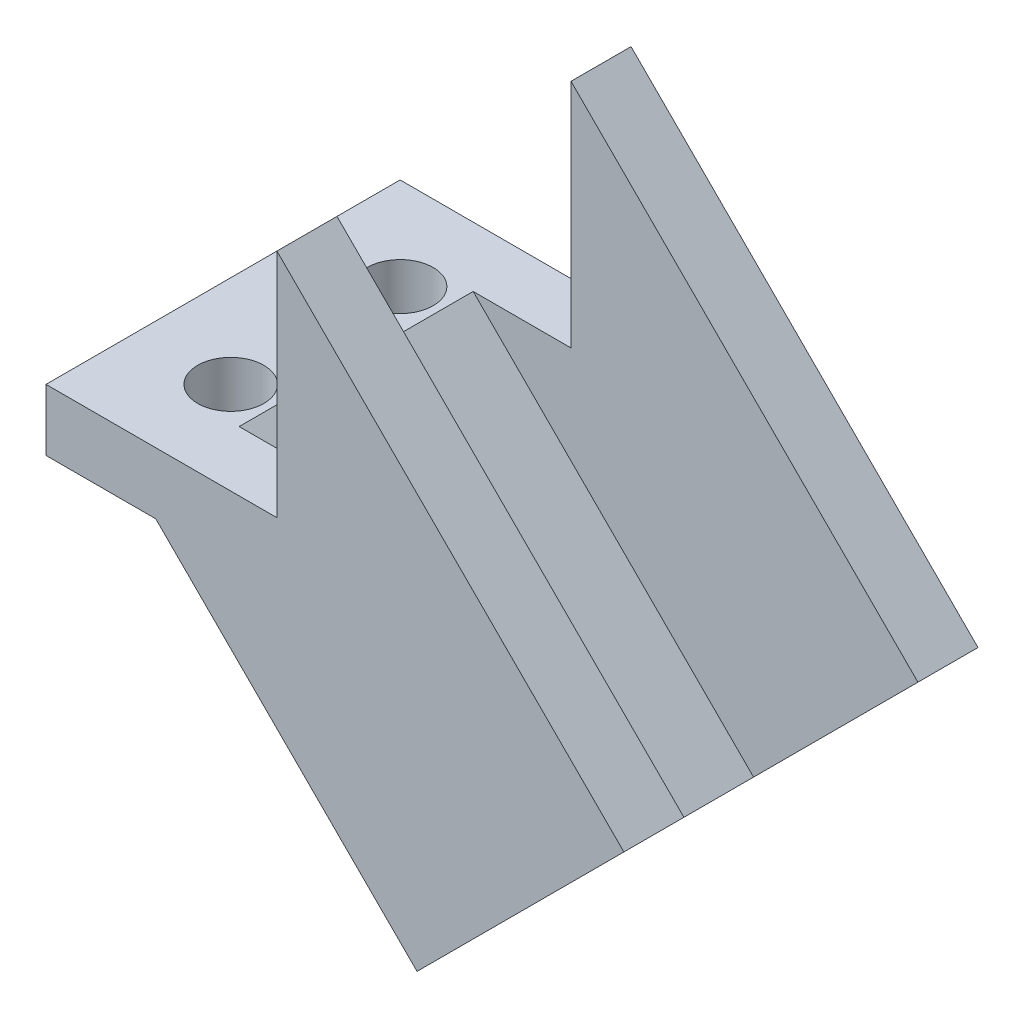
ISO-10303-21;
HEADER;
FILE_DESCRIPTION(('STEP AP214'),'2;1');
FILE_NAME('part.step','',(''),(''),'','','');
FILE_SCHEMA(('AUTOMOTIVE_DESIGN { 1 0 10303 214 1 1 1 1 }'));
ENDSEC;
DATA;
#1=APPLICATION_CONTEXT('core data for automotive mechanical design processes');
#2=APPLICATION_PROTOCOL_DEFINITION('international standard','automotive_design',2000,#1);
#3=PRODUCT_CONTEXT('',#1,'mechanical');
#4=PRODUCT('Part','Part','',(#3));
#5=PRODUCT_RELATED_PRODUCT_CATEGORY('part','',(#4));
#6=PRODUCT_DEFINITION_FORMATION('','',#4);
#7=PRODUCT_DEFINITION_CONTEXT('part definition',#1,'design');
#8=PRODUCT_DEFINITION('design','',#6,#7);
#9=PRODUCT_DEFINITION_SHAPE('','',#8);
#10=(LENGTH_UNIT() NAMED_UNIT(*) SI_UNIT(.MILLI.,.METRE.));
#11=(NAMED_UNIT(*) PLANE_ANGLE_UNIT() SI_UNIT($,.RADIAN.));
#12=(NAMED_UNIT(*) SI_UNIT($,.STERADIAN.) SOLID_ANGLE_UNIT());
#13=UNCERTAINTY_MEASURE_WITH_UNIT(LENGTH_MEASURE(1.E-05),#10,'distance_accuracy_value','');
#14=(GEOMETRIC_REPRESENTATION_CONTEXT(3) GLOBAL_UNCERTAINTY_ASSIGNED_CONTEXT((#13)) GLOBAL_UNIT_ASSIGNED_CONTEXT((#10,
#11,#12)) REPRESENTATION_CONTEXT('',''));
#15=CARTESIAN_POINT('',(0.,0.,0.));
#16=DIRECTION('',(0.,0.,1.));
#17=DIRECTION('',(1.,0.,0.));
#18=AXIS2_PLACEMENT_3D('',#15,#16,#17);
#19=CARTESIAN_POINT('',(-13.8994949366116,276.857098745259,-19.));
#20=DIRECTION('',(-0.707106781186547,-0.707106781186548,0.));
#21=DIRECTION('',(0.707106781186548,-0.707106781186547,0.));
#22=AXIS2_PLACEMENT_3D('',#19,#20,#21);
#23=PLANE('',#22);
#24=CARTESIAN_POINT('',(-19.5563491861039,282.513952994752,-7.5));
#25=DIRECTION('',(-0.707106781186547,-0.707106781186548,0.));
#26=DIRECTION('',(0.707106781186548,-0.707106781186547,0.));
#27=AXIS2_PLACEMENT_3D('',#24,#25,#26);
#28=CIRCLE('',#27,2.15);
#29=CARTESIAN_POINT('',(-18.0360696065529,280.9936734152,-7.5));
#30=VERTEX_POINT('',#29);
#31=EDGE_CURVE('E360',#30,#30,#28,.T.);
#32=ORIENTED_EDGE('',*,*,#31,.F.);
#33=EDGE_LOOP('',(#32));
#34=FACE_BOUND('',#33,.T.);
#35=DIRECTION('',(0.,0.,1.));
#36=VECTOR('',#35,1.);
#37=CARTESIAN_POINT('',(-30.8700576850887,293.827661493736,-19.));
#38=LINE('',#37,#36);
#39=CARTESIAN_POINT('',(-30.8700576850887,293.827661493736,1.83708618159312));
#40=VERTEX_POINT('',#39);
#41=CARTESIAN_POINT('',(-30.8700576850887,293.827661493736,4.));
#42=VERTEX_POINT('',#41);
#43=EDGE_CURVE('E152',#40,#42,#38,.T.);
#44=ORIENTED_EDGE('',*,*,#43,.F.);
#45=CARTESIAN_POINT('',(-32.,294.957603808648,-2.));
#46=DIRECTION('',(-0.707106781186547,-0.707106781186548,0.));
#47=DIRECTION('',(-0.707106781186548,0.707106781186547,0.));
#48=AXIS2_PLACEMENT_3D('',#45,#46,#47);
#49=ELLIPSE('',#48,5.65685424949238,4.);
#50=CARTESIAN_POINT('',(-30.8700576850887,293.827661493736,-5.83708618159312));
#51=VERTEX_POINT('',#50);
#52=EDGE_CURVE('E140',#40,#51,#49,.F.);
#53=ORIENTED_EDGE('',*,*,#52,.T.);
#54=CARTESIAN_POINT('',(-30.8700576850887,293.827661493736,-9.16291381840688));
#55=VERTEX_POINT('',#54);
#56=EDGE_CURVE('E150',#55,#51,#38,.T.);
#57=ORIENTED_EDGE('',*,*,#56,.F.);
#58=CARTESIAN_POINT('',(-32.,294.957603808648,-13.));
#59=DIRECTION('',(-0.707106781186547,-0.707106781186548,0.));
#60=DIRECTION('',(-0.707106781186548,0.707106781186547,0.));
#61=AXIS2_PLACEMENT_3D('',#58,#59,#60);
#62=ELLIPSE('',#61,5.65685424949238,4.);
#63=CARTESIAN_POINT('',(-30.8700576850887,293.827661493736,-16.8370861815931));
#64=VERTEX_POINT('',#63);
#65=EDGE_CURVE('E144',#55,#64,#62,.F.);
#66=ORIENTED_EDGE('',*,*,#65,.T.);
#67=CARTESIAN_POINT('',(-30.8700576850887,293.827661493736,-19.));
#68=VERTEX_POINT('',#67);
#69=EDGE_CURVE('E158',#68,#64,#38,.T.);
#70=ORIENTED_EDGE('',*,*,#69,.F.);
#71=DIRECTION('',(0.707106781186548,-0.707106781186547,0.));
#72=VECTOR('',#71,1.);
#73=CARTESIAN_POINT('',(-13.8994949366116,276.857098745259,-19.));
#74=LINE('',#73,#72);
#75=CARTESIAN_POINT('',(-13.8994949366116,276.857098745259,-19.));
#76=VERTEX_POINT('',#75);
#77=EDGE_CURVE('E250',#68,#76,#74,.T.);
#78=ORIENTED_EDGE('',*,*,#77,.T.);
#79=DIRECTION('',(0.,0.,1.));
#80=VECTOR('',#79,1.);
#81=CARTESIAN_POINT('',(-13.8994949366116,276.857098745259,-19.));
#82=LINE('',#81,#80);
#83=CARTESIAN_POINT('',(-13.8994949366116,276.857098745259,4.));
#84=VERTEX_POINT('',#83);
#85=EDGE_CURVE('E160',#76,#84,#82,.T.);
#86=ORIENTED_EDGE('',*,*,#85,.T.);
#87=DIRECTION('',(0.707106781186548,-0.707106781186547,0.));
#88=VECTOR('',#87,1.);
#89=CARTESIAN_POINT('',(-13.8994949366116,276.857098745259,4.));
#90=LINE('',#89,#88);
#91=EDGE_CURVE('E229',#42,#84,#90,.T.);
#92=ORIENTED_EDGE('',*,*,#91,.F.);
#93=EDGE_LOOP('',(#44,#53,#57,#66,#70,#78,#86,#92));
#94=FACE_BOUND('',#93,.T.);
#95=ADVANCED_FACE('F35',(#34,#94),#23,.T.);
#96=CARTESIAN_POINT('',(-32.,226.827661493736,-13.));
#97=DIRECTION('',(0.,1.,0.));
#98=DIRECTION('',(0.,0.,1.));
#99=AXIS2_PLACEMENT_3D('',#96,#97,#98);
#100=CYLINDRICAL_SURFACE('',#99,2.15);
#101=CARTESIAN_POINT('',(-32.,297.827661493736,-13.));
#102=DIRECTION('',(0.,1.,0.));
#103=DIRECTION('',(0.,0.,1.));
#104=AXIS2_PLACEMENT_3D('',#101,#102,#103);
#105=CIRCLE('',#104,2.15);
#106=CARTESIAN_POINT('',(-32.,297.827661493736,-10.85));
#107=VERTEX_POINT('',#106);
#108=EDGE_CURVE('E153',#107,#107,#105,.F.);
#109=ORIENTED_EDGE('',*,*,#108,.F.);
#110=EDGE_LOOP('',(#109));
#111=FACE_BOUND('',#110,.T.);
#112=CARTESIAN_POINT('',(-32.,293.827661493736,-13.));
#113=DIRECTION('',(0.,-1.,0.));
#114=DIRECTION('',(0.,0.,-1.));
#115=AXIS2_PLACEMENT_3D('',#112,#113,#114);
#116=CIRCLE('',#115,2.15);
#117=CARTESIAN_POINT('',(-32.,293.827661493736,-15.15));
#118=VERTEX_POINT('',#117);
#119=EDGE_CURVE('E181',#118,#118,#116,.F.);
#120=ORIENTED_EDGE('',*,*,#119,.F.);
#121=EDGE_LOOP('',(#120));
#122=FACE_BOUND('',#121,.T.);
#123=ADVANCED_FACE('F280',(#111,#122),#100,.F.);
#124=CARTESIAN_POINT('',(-32.,226.827661493736,-2.));
#125=DIRECTION('',(0.,1.,0.));
#126=DIRECTION('',(0.,0.,1.));
#127=AXIS2_PLACEMENT_3D('',#124,#125,#126);
#128=CYLINDRICAL_SURFACE('',#127,2.15);
#129=CARTESIAN_POINT('',(-32.,297.827661493736,-2.));
#130=DIRECTION('',(0.,1.,0.));
#131=DIRECTION('',(0.,0.,1.));
#132=AXIS2_PLACEMENT_3D('',#129,#130,#131);
#133=CIRCLE('',#132,2.15);
#134=CARTESIAN_POINT('',(-32.,297.827661493736,0.15));
#135=VERTEX_POINT('',#134);
#136=EDGE_CURVE('E182',#135,#135,#133,.F.);
#137=ORIENTED_EDGE('',*,*,#136,.F.);
#138=EDGE_LOOP('',(#137));
#139=FACE_BOUND('',#138,.T.);
#140=CARTESIAN_POINT('',(-32.,293.827661493736,-2.));
#141=DIRECTION('',(0.,-1.,0.));
#142=DIRECTION('',(0.,0.,-1.));
#143=AXIS2_PLACEMENT_3D('',#140,#141,#142);
#144=CIRCLE('',#143,2.15);
#145=CARTESIAN_POINT('',(-32.,293.827661493736,-4.15));
#146=VERTEX_POINT('',#145);
#147=EDGE_CURVE('E184',#146,#146,#144,.F.);
#148=ORIENTED_EDGE('',*,*,#147,.F.);
#149=EDGE_LOOP('',(#148));
#150=FACE_BOUND('',#149,.T.);
#151=ADVANCED_FACE('F285',(#139,#150),#128,.F.);
#152=CARTESIAN_POINT('',(-0.464466094067211,290.292127587804,-19.));
#153=DIRECTION('',(0.707106781186547,0.707106781186548,0.));
#154=DIRECTION('',(-0.707106781186548,0.707106781186547,0.));
#155=AXIS2_PLACEMENT_3D('',#152,#153,#154);
#156=PLANE('',#155);
#157=DIRECTION('',(0.707106781186548,-0.707106781186547,0.));
#158=VECTOR('',#157,1.);
#159=CARTESIAN_POINT('',(-0.464466094067211,290.292127587804,0.100000000000003));
#160=LINE('',#159,#158);
#161=CARTESIAN_POINT('',(-23.,312.827661493736,0.100000000000003));
#162=VERTEX_POINT('',#161);
#163=CARTESIAN_POINT('',(-0.464466094067232,290.292127587804,0.100000000000003));
#164=VERTEX_POINT('',#163);
#165=EDGE_CURVE('E212',#162,#164,#160,.T.);
#166=ORIENTED_EDGE('',*,*,#165,.F.);
#167=DIRECTION('',(0.,0.,1.));
#168=VECTOR('',#167,1.);
#169=CARTESIAN_POINT('',(-23.,312.827661493736,-19.));
#170=LINE('',#169,#168);
#171=CARTESIAN_POINT('',(-23.,312.827661493736,4.));
#172=VERTEX_POINT('',#171);
#173=EDGE_CURVE('E175',#162,#172,#170,.T.);
#174=ORIENTED_EDGE('',*,*,#173,.T.);
#175=DIRECTION('',(-0.707106781186548,0.707106781186547,0.));
#176=VECTOR('',#175,1.);
#177=CARTESIAN_POINT('',(-0.464466094067211,290.292127587804,4.));
#178=LINE('',#177,#176);
#179=CARTESIAN_POINT('',(-0.464466094067211,290.292127587804,4.));
#180=VERTEX_POINT('',#179);
#181=EDGE_CURVE('E214',#180,#172,#178,.T.);
#182=ORIENTED_EDGE('',*,*,#181,.F.);
#183=DIRECTION('',(0.,0.,1.));
#184=VECTOR('',#183,1.);
#185=CARTESIAN_POINT('',(-0.464466094067211,290.292127587804,-19.));
#186=LINE('',#185,#184);
#187=EDGE_CURVE('E253',#164,#180,#186,.T.);
#188=ORIENTED_EDGE('',*,*,#187,.F.);
#189=EDGE_LOOP('',(#166,#174,#182,#188));
#190=FACE_BOUND('',#189,.T.);
#191=ADVANCED_FACE('F276',(#190),#156,.T.);
#192=CARTESIAN_POINT('',(-23.,312.827661493736,-19.));
#193=DIRECTION('',(-1.,0.,0.));
#194=DIRECTION('',(0.,0.,1.));
#195=AXIS2_PLACEMENT_3D('',#192,#193,#194);
#196=PLANE('',#195);
#197=DIRECTION('',(0.,1.,0.));
#198=VECTOR('',#197,1.);
#199=CARTESIAN_POINT('',(-23.,312.827661493736,0.100000000000003));
#200=LINE('',#199,#198);
#201=CARTESIAN_POINT('',(-23.,297.827661493736,0.0999999999999997));
#202=VERTEX_POINT('',#201);
#203=EDGE_CURVE('E44',#202,#162,#200,.T.);
#204=ORIENTED_EDGE('',*,*,#203,.F.);
#205=DIRECTION('',(0.,0.,1.));
#206=VECTOR('',#205,1.);
#207=CARTESIAN_POINT('',(-23.,297.827661493736,-19.));
#208=LINE('',#207,#206);
#209=CARTESIAN_POINT('',(-23.,297.827661493736,4.));
#210=VERTEX_POINT('',#209);
#211=EDGE_CURVE('E171',#202,#210,#208,.T.);
#212=ORIENTED_EDGE('',*,*,#211,.T.);
#213=DIRECTION('',(0.,-1.,0.));
#214=VECTOR('',#213,1.);
#215=CARTESIAN_POINT('',(-23.,312.827661493736,4.));
#216=LINE('',#215,#214);
#217=EDGE_CURVE('E217',#172,#210,#216,.T.);
#218=ORIENTED_EDGE('',*,*,#217,.F.);
#219=ORIENTED_EDGE('',*,*,#173,.F.);
#220=EDGE_LOOP('',(#204,#212,#218,#219));
#221=FACE_BOUND('',#220,.T.);
#222=ADVANCED_FACE('F274',(#221),#196,.T.);
#223=DIRECTION('',(-0.707106781186548,0.707106781186547,0.));
#224=VECTOR('',#223,1.);
#225=CARTESIAN_POINT('',(-0.464466094067211,290.292127587804,-15.1));
#226=LINE('',#225,#224);
#227=CARTESIAN_POINT('',(-0.46446609406723,290.292127587804,-15.1));
#228=VERTEX_POINT('',#227);
#229=CARTESIAN_POINT('',(-23.,312.827661493736,-15.1));
#230=VERTEX_POINT('',#229);
#231=EDGE_CURVE('E52',#228,#230,#226,.T.);
#232=ORIENTED_EDGE('',*,*,#231,.F.);
#233=CARTESIAN_POINT('',(-0.464466094067211,290.292127587804,-19.));
#234=VERTEX_POINT('',#233);
#235=EDGE_CURVE('E178',#234,#228,#186,.T.);
#236=ORIENTED_EDGE('',*,*,#235,.F.);
#237=DIRECTION('',(-0.707106781186548,0.707106781186547,0.));
#238=VECTOR('',#237,1.);
#239=CARTESIAN_POINT('',(-0.464466094067211,290.292127587804,-19.));
#240=LINE('',#239,#238);
#241=CARTESIAN_POINT('',(-23.,312.827661493736,-19.));
#242=VERTEX_POINT('',#241);
#243=EDGE_CURVE('E235',#234,#242,#240,.T.);
#244=ORIENTED_EDGE('',*,*,#243,.T.);
#245=EDGE_CURVE('E172',#242,#230,#170,.T.);
#246=ORIENTED_EDGE('',*,*,#245,.T.);
#247=EDGE_LOOP('',(#232,#236,#244,#246));
#248=FACE_BOUND('',#247,.T.);
#249=ADVANCED_FACE('F37',(#248),#156,.T.);
#250=CARTESIAN_POINT('',(-11.0710678118654,279.685525870005,-19.));
#251=DIRECTION('',(0.707106781186548,-0.707106781186547,0.));
#252=DIRECTION('',(0.707106781186547,0.707106781186548,0.));
#253=AXIS2_PLACEMENT_3D('',#250,#251,#252);
#254=PLANE('',#253);
#255=DIRECTION('',(-0.707106781186548,-0.707106781186548,0.));
#256=VECTOR('',#255,1.);
#257=CARTESIAN_POINT('',(-0.378296840935349,290.378296840935,0.100000000000003));
#258=LINE('',#257,#256);
#259=CARTESIAN_POINT('',(-11.1417784899841,279.614815191887,0.0999999999999984));
#260=VERTEX_POINT('',#259);
#261=EDGE_CURVE('E188',#164,#260,#258,.T.);
#262=ORIENTED_EDGE('',*,*,#261,.F.);
#263=ORIENTED_EDGE('',*,*,#187,.T.);
#264=DIRECTION('',(0.707106781186549,0.707106781186546,0.));
#265=VECTOR('',#264,1.);
#266=CARTESIAN_POINT('',(-11.0710678118654,279.685525870005,4.));
#267=LINE('',#266,#265);
#268=EDGE_CURVE('E232',#84,#180,#267,.T.);
#269=ORIENTED_EDGE('',*,*,#268,.F.);
#270=ORIENTED_EDGE('',*,*,#85,.F.);
#271=DIRECTION('',(0.707106781186549,0.707106781186546,0.));
#272=VECTOR('',#271,1.);
#273=CARTESIAN_POINT('',(-11.0710678118654,279.685525870005,-19.));
#274=LINE('',#273,#272);
#275=EDGE_CURVE('E60',#76,#234,#274,.T.);
#276=ORIENTED_EDGE('',*,*,#275,.T.);
#277=ORIENTED_EDGE('',*,*,#235,.T.);
#278=DIRECTION('',(0.707106781186548,0.707106781186548,0.));
#279=VECTOR('',#278,1.);
#280=CARTESIAN_POINT('',(-0.378296840935349,290.378296840935,-15.1));
#281=LINE('',#280,#279);
#282=CARTESIAN_POINT('',(-11.1417784899841,279.614815191887,-15.1));
#283=VERTEX_POINT('',#282);
#284=EDGE_CURVE('E201',#283,#228,#281,.T.);
#285=ORIENTED_EDGE('',*,*,#284,.F.);
#286=DIRECTION('',(0.,0.,-1.));
#287=VECTOR('',#286,1.);
#288=CARTESIAN_POINT('',(-11.1417784899841,279.614815191887,0.0999999999999984));
#289=LINE('',#288,#287);
#290=EDGE_CURVE('E198',#260,#283,#289,.T.);
#291=ORIENTED_EDGE('',*,*,#290,.F.);
#292=EDGE_LOOP('',(#262,#263,#269,#270,#276,#277,#285,#291));
#293=FACE_BOUND('',#292,.T.);
#294=ADVANCED_FACE('F263',(#293),#254,.T.);
#295=CARTESIAN_POINT('',(-38.,293.827661493736,-19.));
#296=DIRECTION('',(0.,-1.,0.));
#297=DIRECTION('',(0.,0.,-1.));
#298=AXIS2_PLACEMENT_3D('',#295,#296,#297);
#299=PLANE('',#298);
#300=ORIENTED_EDGE('',*,*,#147,.T.);
#301=EDGE_LOOP('',(#300));
#302=FACE_BOUND('',#301,.T.);
#303=ORIENTED_EDGE('',*,*,#119,.T.);
#304=EDGE_LOOP('',(#303));
#305=FACE_BOUND('',#304,.T.);
#306=ORIENTED_EDGE('',*,*,#56,.T.);
#307=CARTESIAN_POINT('',(-32.,293.827661493736,-2.));
#308=DIRECTION('',(0.,-1.,0.));
#309=DIRECTION('',(0.,0.,-1.));
#310=AXIS2_PLACEMENT_3D('',#307,#308,#309);
#311=CIRCLE('',#310,4.);
#312=EDGE_CURVE('E137',#51,#40,#311,.T.);
#313=ORIENTED_EDGE('',*,*,#312,.T.);
#314=ORIENTED_EDGE('',*,*,#43,.T.);
#315=DIRECTION('',(1.,0.,0.));
#316=VECTOR('',#315,1.);
#317=CARTESIAN_POINT('',(-38.,293.827661493736,4.));
#318=LINE('',#317,#316);
#319=CARTESIAN_POINT('',(-38.,293.827661493736,4.));
#320=VERTEX_POINT('',#319);
#321=EDGE_CURVE('E226',#320,#42,#318,.T.);
#322=ORIENTED_EDGE('',*,*,#321,.F.);
#323=DIRECTION('',(0.,0.,1.));
#324=VECTOR('',#323,1.);
#325=CARTESIAN_POINT('',(-38.,293.827661493736,-19.));
#326=LINE('',#325,#324);
#327=CARTESIAN_POINT('',(-38.,293.827661493736,-19.));
#328=VERTEX_POINT('',#327);
#329=EDGE_CURVE('E161',#328,#320,#326,.T.);
#330=ORIENTED_EDGE('',*,*,#329,.F.);
#331=DIRECTION('',(1.,0.,0.));
#332=VECTOR('',#331,1.);
#333=CARTESIAN_POINT('',(-38.,293.827661493736,-19.));
#334=LINE('',#333,#332);
#335=EDGE_CURVE('E247',#328,#68,#334,.T.);
#336=ORIENTED_EDGE('',*,*,#335,.T.);
#337=ORIENTED_EDGE('',*,*,#69,.T.);
#338=CARTESIAN_POINT('',(-32.,293.827661493736,-13.));
#339=DIRECTION('',(0.,-1.,0.));
#340=DIRECTION('',(0.,0.,-1.));
#341=AXIS2_PLACEMENT_3D('',#338,#339,#340);
#342=CIRCLE('',#341,4.);
#343=EDGE_CURVE('E145',#64,#55,#342,.T.);
#344=ORIENTED_EDGE('',*,*,#343,.T.);
#345=EDGE_LOOP('',(#306,#313,#314,#322,#330,#336,#337,#344));
#346=FACE_BOUND('',#345,.T.);
#347=ADVANCED_FACE('F156',(#302,#305,#346),#299,.T.);
#348=CARTESIAN_POINT('',(-38.,297.827661493736,-19.));
#349=DIRECTION('',(-1.,0.,0.));
#350=DIRECTION('',(0.,-1.,0.));
#351=AXIS2_PLACEMENT_3D('',#348,#349,#350);
#352=PLANE('',#351);
#353=ORIENTED_EDGE('',*,*,#329,.T.);
#354=DIRECTION('',(0.,-1.,0.));
#355=VECTOR('',#354,1.);
#356=CARTESIAN_POINT('',(-38.,297.827661493736,4.));
#357=LINE('',#356,#355);
#358=CARTESIAN_POINT('',(-38.,297.827661493736,4.));
#359=VERTEX_POINT('',#358);
#360=EDGE_CURVE('E223',#359,#320,#357,.T.);
#361=ORIENTED_EDGE('',*,*,#360,.F.);
#362=DIRECTION('',(0.,0.,1.));
#363=VECTOR('',#362,1.);
#364=CARTESIAN_POINT('',(-38.,297.827661493736,-19.));
#365=LINE('',#364,#363);
#366=CARTESIAN_POINT('',(-38.,297.827661493736,-19.));
#367=VERTEX_POINT('',#366);
#368=EDGE_CURVE('E166',#367,#359,#365,.T.);
#369=ORIENTED_EDGE('',*,*,#368,.F.);
#370=DIRECTION('',(0.,-1.,0.));
#371=VECTOR('',#370,1.);
#372=CARTESIAN_POINT('',(-38.,297.827661493736,-19.));
#373=LINE('',#372,#371);
#374=EDGE_CURVE('E244',#367,#328,#373,.T.);
#375=ORIENTED_EDGE('',*,*,#374,.T.);
#376=EDGE_LOOP('',(#353,#361,#369,#375));
#377=FACE_BOUND('',#376,.T.);
#378=ADVANCED_FACE('F271',(#377),#352,.T.);
#379=CARTESIAN_POINT('',(-23.,297.827661493736,-19.));
#380=DIRECTION('',(0.,1.,0.));
#381=DIRECTION('',(0.,0.,1.));
#382=AXIS2_PLACEMENT_3D('',#379,#380,#381);
#383=PLANE('',#382);
#384=ORIENTED_EDGE('',*,*,#136,.T.);
#385=EDGE_LOOP('',(#384));
#386=FACE_BOUND('',#385,.T.);
#387=ORIENTED_EDGE('',*,*,#108,.T.);
#388=EDGE_LOOP('',(#387));
#389=FACE_BOUND('',#388,.T.);
#390=DIRECTION('',(1.,0.,0.));
#391=VECTOR('',#390,1.);
#392=CARTESIAN_POINT('',(-23.,297.827661493736,0.0999999999999994));
#393=LINE('',#392,#391);
#394=CARTESIAN_POINT('',(-29.3546247918337,297.827661493736,0.0999999999999984));
#395=VERTEX_POINT('',#394);
#396=EDGE_CURVE('E210',#395,#202,#393,.T.);
#397=ORIENTED_EDGE('',*,*,#396,.F.);
#398=DIRECTION('',(0.,0.,1.));
#399=VECTOR('',#398,1.);
#400=CARTESIAN_POINT('',(-29.3546247918337,297.827661493736,-19.));
#401=LINE('',#400,#399);
#402=CARTESIAN_POINT('',(-29.3546247918337,297.827661493736,-15.1));
#403=VERTEX_POINT('',#402);
#404=EDGE_CURVE('E11',#403,#395,#401,.T.);
#405=ORIENTED_EDGE('',*,*,#404,.F.);
#406=DIRECTION('',(-1.,0.,0.));
#407=VECTOR('',#406,1.);
#408=CARTESIAN_POINT('',(-23.,297.827661493736,-15.1));
#409=LINE('',#408,#407);
#410=CARTESIAN_POINT('',(-23.,297.827661493736,-15.1));
#411=VERTEX_POINT('',#410);
#412=EDGE_CURVE('E206',#411,#403,#409,.T.);
#413=ORIENTED_EDGE('',*,*,#412,.F.);
#414=CARTESIAN_POINT('',(-23.,297.827661493736,-19.));
#415=VERTEX_POINT('',#414);
#416=EDGE_CURVE('E168',#415,#411,#208,.T.);
#417=ORIENTED_EDGE('',*,*,#416,.F.);
#418=DIRECTION('',(-1.,0.,0.));
#419=VECTOR('',#418,1.);
#420=CARTESIAN_POINT('',(-23.,297.827661493736,-19.));
#421=LINE('',#420,#419);
#422=EDGE_CURVE('E241',#415,#367,#421,.T.);
#423=ORIENTED_EDGE('',*,*,#422,.T.);
#424=ORIENTED_EDGE('',*,*,#368,.T.);
#425=DIRECTION('',(-1.,0.,0.));
#426=VECTOR('',#425,1.);
#427=CARTESIAN_POINT('',(-23.,297.827661493736,4.));
#428=LINE('',#427,#426);
#429=EDGE_CURVE('E220',#210,#359,#428,.T.);
#430=ORIENTED_EDGE('',*,*,#429,.F.);
#431=ORIENTED_EDGE('',*,*,#211,.F.);
#432=EDGE_LOOP('',(#397,#405,#413,#417,#423,#424,#430,#431));
#433=FACE_BOUND('',#432,.T.);
#434=ADVANCED_FACE('F292',(#386,#389,#433),#383,.T.);
#435=DIRECTION('',(0.,-1.,0.));
#436=VECTOR('',#435,1.);
#437=CARTESIAN_POINT('',(-23.,312.827661493736,-15.1));
#438=LINE('',#437,#436);
#439=EDGE_CURVE('E176',#230,#411,#438,.T.);
#440=ORIENTED_EDGE('',*,*,#439,.F.);
#441=ORIENTED_EDGE('',*,*,#245,.F.);
#442=DIRECTION('',(0.,-1.,0.));
#443=VECTOR('',#442,1.);
#444=CARTESIAN_POINT('',(-23.,312.827661493736,-19.));
#445=LINE('',#444,#443);
#446=EDGE_CURVE('E238',#242,#415,#445,.T.);
#447=ORIENTED_EDGE('',*,*,#446,.T.);
#448=ORIENTED_EDGE('',*,*,#416,.T.);
#449=EDGE_LOOP('',(#440,#441,#447,#448));
#450=FACE_BOUND('',#449,.T.);
#451=ADVANCED_FACE('F295',(#450),#196,.T.);
#452=CARTESIAN_POINT('',(0.,0.,-19.));
#453=DIRECTION('',(0.,0.,1.));
#454=DIRECTION('',(1.,0.,0.));
#455=AXIS2_PLACEMENT_3D('',#452,#453,#454);
#456=PLANE('',#455);
#457=ORIENTED_EDGE('',*,*,#243,.F.);
#458=ORIENTED_EDGE('',*,*,#275,.F.);
#459=ORIENTED_EDGE('',*,*,#77,.F.);
#460=ORIENTED_EDGE('',*,*,#335,.F.);
#461=ORIENTED_EDGE('',*,*,#374,.F.);
#462=ORIENTED_EDGE('',*,*,#422,.F.);
#463=ORIENTED_EDGE('',*,*,#446,.F.);
#464=EDGE_LOOP('',(#457,#458,#459,#460,#461,#462,#463));
#465=FACE_BOUND('',#464,.T.);
#466=ADVANCED_FACE('F297',(#465),#456,.F.);
#467=CARTESIAN_POINT('',(0.,0.,4.));
#468=DIRECTION('',(0.,0.,1.));
#469=DIRECTION('',(1.,0.,0.));
#470=AXIS2_PLACEMENT_3D('',#467,#468,#469);
#471=PLANE('',#470);
#472=ORIENTED_EDGE('',*,*,#181,.T.);
#473=ORIENTED_EDGE('',*,*,#217,.T.);
#474=ORIENTED_EDGE('',*,*,#429,.T.);
#475=ORIENTED_EDGE('',*,*,#360,.T.);
#476=ORIENTED_EDGE('',*,*,#321,.T.);
#477=ORIENTED_EDGE('',*,*,#91,.T.);
#478=ORIENTED_EDGE('',*,*,#268,.T.);
#479=EDGE_LOOP('',(#472,#473,#474,#475,#476,#477,#478));
#480=FACE_BOUND('',#479,.T.);
#481=ADVANCED_FACE('F260',(#480),#471,.T.);
#482=CARTESIAN_POINT('',(-47.7544511804341,337.754451180434,0.100000000000003));
#483=DIRECTION('',(0.,0.,1.));
#484=DIRECTION('',(0.,-1.,0.));
#485=AXIS2_PLACEMENT_3D('',#482,#483,#484);
#486=PLANE('',#485);
#487=ORIENTED_EDGE('',*,*,#165,.T.);
#488=ORIENTED_EDGE('',*,*,#261,.T.);
#489=DIRECTION('',(0.707106781186548,-0.707106781186547,0.));
#490=VECTOR('',#489,1.);
#491=CARTESIAN_POINT('',(-58.5179328294828,326.990969531385,0.0999999999999984));
#492=LINE('',#491,#490);
#493=EDGE_CURVE('E203',#395,#260,#492,.T.);
#494=ORIENTED_EDGE('',*,*,#493,.F.);
#495=ORIENTED_EDGE('',*,*,#396,.T.);
#496=ORIENTED_EDGE('',*,*,#203,.T.);
#497=EDGE_LOOP('',(#487,#488,#494,#495,#496));
#498=FACE_BOUND('',#497,.T.);
#499=ADVANCED_FACE('F331',(#498),#486,.F.);
#500=CARTESIAN_POINT('',(-47.7544511804341,337.754451180434,-15.1));
#501=DIRECTION('',(0.,0.,-1.));
#502=DIRECTION('',(0.,1.,0.));
#503=AXIS2_PLACEMENT_3D('',#500,#501,#502);
#504=PLANE('',#503);
#505=ORIENTED_EDGE('',*,*,#231,.T.);
#506=ORIENTED_EDGE('',*,*,#439,.T.);
#507=ORIENTED_EDGE('',*,*,#412,.T.);
#508=DIRECTION('',(0.707106781186548,-0.707106781186547,0.));
#509=VECTOR('',#508,1.);
#510=CARTESIAN_POINT('',(-58.5179328294828,326.990969531385,-15.1));
#511=LINE('',#510,#509);
#512=EDGE_CURVE('E204',#403,#283,#511,.T.);
#513=ORIENTED_EDGE('',*,*,#512,.T.);
#514=ORIENTED_EDGE('',*,*,#284,.T.);
#515=EDGE_LOOP('',(#505,#506,#507,#513,#514));
#516=FACE_BOUND('',#515,.T.);
#517=ADVANCED_FACE('F326',(#516),#504,.F.);
#518=CARTESIAN_POINT('',(-58.5179328294828,326.990969531385,0.0999999999999984));
#519=DIRECTION('',(-0.707106781186547,-0.707106781186548,0.));
#520=DIRECTION('',(0.707106781186548,-0.707106781186547,0.));
#521=AXIS2_PLACEMENT_3D('',#518,#519,#520);
#522=PLANE('',#521);
#523=CARTESIAN_POINT('',(-16.7986327394764,285.271669441379,-7.5));
#524=DIRECTION('',(-0.707106781186547,-0.707106781186548,0.));
#525=DIRECTION('',(0.707106781186548,-0.707106781186547,0.));
#526=AXIS2_PLACEMENT_3D('',#523,#524,#525);
#527=CIRCLE('',#526,2.15);
#528=CARTESIAN_POINT('',(-15.2783531599254,283.751389861828,-7.5));
#529=VERTEX_POINT('',#528);
#530=EDGE_CURVE('E39',#529,#529,#527,.T.);
#531=ORIENTED_EDGE('',*,*,#530,.T.);
#532=EDGE_LOOP('',(#531));
#533=FACE_BOUND('',#532,.T.);
#534=ORIENTED_EDGE('',*,*,#404,.T.);
#535=ORIENTED_EDGE('',*,*,#493,.T.);
#536=ORIENTED_EDGE('',*,*,#290,.T.);
#537=ORIENTED_EDGE('',*,*,#512,.F.);
#538=EDGE_LOOP('',(#534,#535,#536,#537));
#539=FACE_BOUND('',#538,.T.);
#540=ADVANCED_FACE('F330',(#533,#539),#522,.F.);
#541=CARTESIAN_POINT('',(-32.,226.827661493736,-2.));
#542=DIRECTION('',(0.,1.,0.));
#543=DIRECTION('',(0.,0.,1.));
#544=AXIS2_PLACEMENT_3D('',#541,#542,#543);
#545=CYLINDRICAL_SURFACE('',#544,4.);
#546=ORIENTED_EDGE('',*,*,#312,.F.);
#547=ORIENTED_EDGE('',*,*,#52,.F.);
#548=EDGE_LOOP('',(#546,#547));
#549=FACE_BOUND('',#548,.T.);
#550=ADVANCED_FACE('F139',(#549),#545,.F.);
#551=CARTESIAN_POINT('',(-32.,226.827661493736,-13.));
#552=DIRECTION('',(0.,1.,0.));
#553=DIRECTION('',(0.,0.,1.));
#554=AXIS2_PLACEMENT_3D('',#551,#552,#553);
#555=CYLINDRICAL_SURFACE('',#554,4.);
#556=ORIENTED_EDGE('',*,*,#343,.F.);
#557=ORIENTED_EDGE('',*,*,#65,.F.);
#558=EDGE_LOOP('',(#556,#557));
#559=FACE_BOUND('',#558,.T.);
#560=ADVANCED_FACE('F347',(#559),#555,.F.);
#561=CARTESIAN_POINT('',(27.8198051533947,329.89010733425,-7.5));
#562=DIRECTION('',(-0.707106781186547,-0.707106781186548,0.));
#563=DIRECTION('',(0.707106781186548,-0.707106781186547,0.));
#564=AXIS2_PLACEMENT_3D('',#561,#562,#563);
#565=CYLINDRICAL_SURFACE('',#564,2.15);
#566=ORIENTED_EDGE('',*,*,#31,.T.);
#567=EDGE_LOOP('',(#566));
#568=FACE_BOUND('',#567,.T.);
#569=ORIENTED_EDGE('',*,*,#530,.F.);
#570=EDGE_LOOP('',(#569));
#571=FACE_BOUND('',#570,.T.);
#572=ADVANCED_FACE('F350',(#568,#571),#565,.F.);
#573=CLOSED_SHELL('',(#95,#123,#151,#191,#222,#249,#294,#347,#378,#434,#451,#466,#481,#499,#517,
#540,#550,#560,#572));
#574=MANIFOLD_SOLID_BREP('B2',#573);
#575=ADVANCED_BREP_SHAPE_REPRESENTATION('',(#18,#574),#14);
#576=SHAPE_DEFINITION_REPRESENTATION(#9,#575);
ENDSEC;
END-ISO-10303-21;
